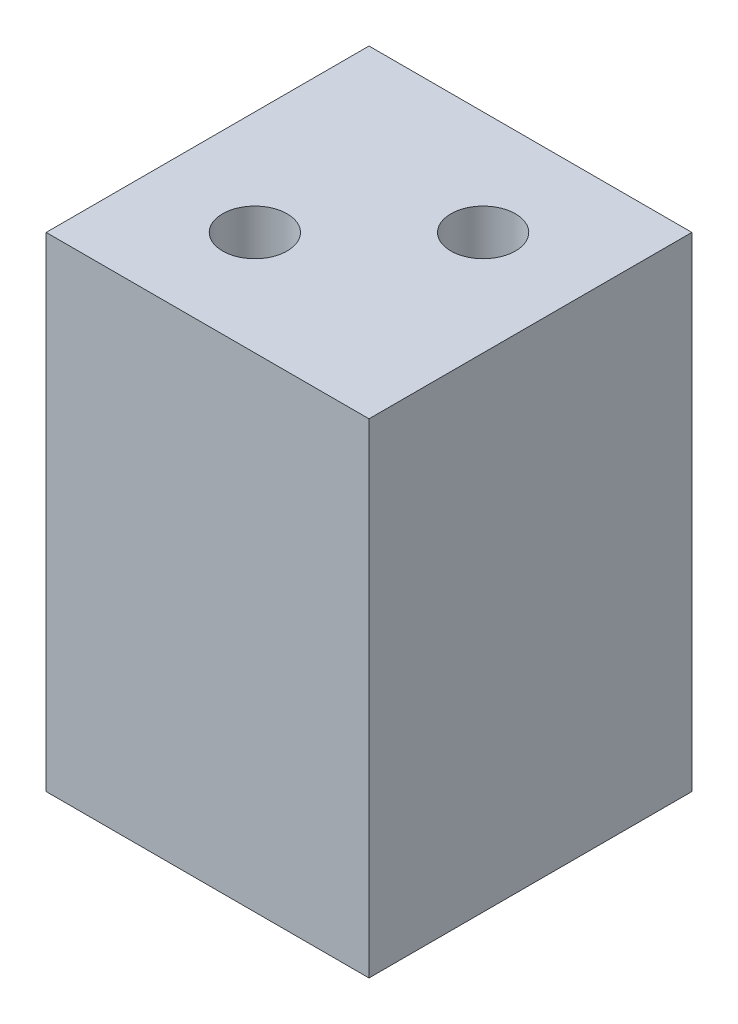
ISO-10303-21;
HEADER;
FILE_DESCRIPTION(('STEP AP214'),'2;1');
FILE_NAME('part.step','',(''),(''),'','','');
FILE_SCHEMA(('AUTOMOTIVE_DESIGN { 1 0 10303 214 1 1 1 1 }'));
ENDSEC;
DATA;
#1=APPLICATION_CONTEXT('core data for automotive mechanical design processes');
#2=APPLICATION_PROTOCOL_DEFINITION('international standard','automotive_design',2000,#1);
#3=PRODUCT_CONTEXT('',#1,'mechanical');
#4=PRODUCT('Part','Part','',(#3));
#5=PRODUCT_RELATED_PRODUCT_CATEGORY('part','',(#4));
#6=PRODUCT_DEFINITION_FORMATION('','',#4);
#7=PRODUCT_DEFINITION_CONTEXT('part definition',#1,'design');
#8=PRODUCT_DEFINITION('design','',#6,#7);
#9=PRODUCT_DEFINITION_SHAPE('','',#8);
#10=(LENGTH_UNIT() NAMED_UNIT(*) SI_UNIT(.MILLI.,.METRE.));
#11=(NAMED_UNIT(*) PLANE_ANGLE_UNIT() SI_UNIT($,.RADIAN.));
#12=(NAMED_UNIT(*) SI_UNIT($,.STERADIAN.) SOLID_ANGLE_UNIT());
#13=UNCERTAINTY_MEASURE_WITH_UNIT(LENGTH_MEASURE(1.E-05),#10,'distance_accuracy_value','');
#14=(GEOMETRIC_REPRESENTATION_CONTEXT(3) GLOBAL_UNCERTAINTY_ASSIGNED_CONTEXT((#13)) GLOBAL_UNIT_ASSIGNED_CONTEXT((#10,
#11,#12)) REPRESENTATION_CONTEXT('',''));
#15=CARTESIAN_POINT('',(0.,0.,0.));
#16=DIRECTION('',(0.,0.,1.));
#17=DIRECTION('',(1.,0.,0.));
#18=AXIS2_PLACEMENT_3D('',#15,#16,#17);
#19=CARTESIAN_POINT('',(0.,45.,0.));
#20=DIRECTION('',(0.,1.,0.));
#21=DIRECTION('',(0.,0.,1.));
#22=AXIS2_PLACEMENT_3D('',#19,#20,#21);
#23=PLANE('',#22);
#24=CARTESIAN_POINT('',(-5.30330085889911,45.,5.3033008588991));
#25=DIRECTION('',(0.,1.,0.));
#26=DIRECTION('',(0.,0.,1.));
#27=AXIS2_PLACEMENT_3D('',#24,#25,#26);
#28=CIRCLE('',#27,3.);
#29=CARTESIAN_POINT('',(-5.30330085889911,45.,2.3033008588991));
#30=VERTEX_POINT('',#29);
#31=EDGE_CURVE('E100',#30,#30,#28,.T.);
#32=ORIENTED_EDGE('',*,*,#31,.F.);
#33=EDGE_LOOP('',(#32));
#34=FACE_BOUND('',#33,.T.);
#35=DIRECTION('',(0.,0.,1.));
#36=VECTOR('',#35,1.);
#37=CARTESIAN_POINT('',(-15.,45.,-15.));
#38=LINE('',#37,#36);
#39=CARTESIAN_POINT('',(-15.,45.,-15.));
#40=VERTEX_POINT('',#39);
#41=CARTESIAN_POINT('',(-15.,45.,15.));
#42=VERTEX_POINT('',#41);
#43=EDGE_CURVE('E85',#40,#42,#38,.T.);
#44=ORIENTED_EDGE('',*,*,#43,.T.);
#45=DIRECTION('',(1.,0.,0.));
#46=VECTOR('',#45,1.);
#47=CARTESIAN_POINT('',(-15.,45.,15.));
#48=LINE('',#47,#46);
#49=CARTESIAN_POINT('',(15.,45.,15.));
#50=VERTEX_POINT('',#49);
#51=EDGE_CURVE('E80',#42,#50,#48,.T.);
#52=ORIENTED_EDGE('',*,*,#51,.T.);
#53=DIRECTION('',(0.,0.,-1.));
#54=VECTOR('',#53,1.);
#55=CARTESIAN_POINT('',(15.,45.,-15.));
#56=LINE('',#55,#54);
#57=CARTESIAN_POINT('',(15.,45.,-15.));
#58=VERTEX_POINT('',#57);
#59=EDGE_CURVE('E83',#50,#58,#56,.T.);
#60=ORIENTED_EDGE('',*,*,#59,.T.);
#61=DIRECTION('',(-1.,0.,0.));
#62=VECTOR('',#61,1.);
#63=CARTESIAN_POINT('',(-15.,45.,-15.));
#64=LINE('',#63,#62);
#65=EDGE_CURVE('E50',#58,#40,#64,.T.);
#66=ORIENTED_EDGE('',*,*,#65,.T.);
#67=EDGE_LOOP('',(#44,#52,#60,#66));
#68=FACE_BOUND('',#67,.T.);
#69=CARTESIAN_POINT('',(5.3033008588991,45.,-5.30330085889911));
#70=DIRECTION('',(0.,1.,0.));
#71=DIRECTION('',(0.,0.,1.));
#72=AXIS2_PLACEMENT_3D('',#69,#70,#71);
#73=CIRCLE('',#72,3.);
#74=CARTESIAN_POINT('',(5.3033008588991,45.,-8.30330085889911));
#75=VERTEX_POINT('',#74);
#76=EDGE_CURVE('E115',#75,#75,#73,.T.);
#77=ORIENTED_EDGE('',*,*,#76,.F.);
#78=EDGE_LOOP('',(#77));
#79=FACE_BOUND('',#78,.T.);
#80=ADVANCED_FACE('F33',(#34,#68,#79),#23,.T.);
#81=CARTESIAN_POINT('',(0.,0.,0.));
#82=DIRECTION('',(0.,1.,0.));
#83=DIRECTION('',(0.,0.,1.));
#84=AXIS2_PLACEMENT_3D('',#81,#82,#83);
#85=PLANE('',#84);
#86=DIRECTION('',(0.,0.,1.));
#87=VECTOR('',#86,1.);
#88=CARTESIAN_POINT('',(-15.,0.,-15.));
#89=LINE('',#88,#87);
#90=CARTESIAN_POINT('',(-15.,0.,-15.));
#91=VERTEX_POINT('',#90);
#92=CARTESIAN_POINT('',(-15.,0.,15.));
#93=VERTEX_POINT('',#92);
#94=EDGE_CURVE('E97',#91,#93,#89,.T.);
#95=ORIENTED_EDGE('',*,*,#94,.F.);
#96=DIRECTION('',(-1.,0.,0.));
#97=VECTOR('',#96,1.);
#98=CARTESIAN_POINT('',(-15.,0.,-15.));
#99=LINE('',#98,#97);
#100=CARTESIAN_POINT('',(15.,0.,-15.));
#101=VERTEX_POINT('',#100);
#102=EDGE_CURVE('E73',#101,#91,#99,.T.);
#103=ORIENTED_EDGE('',*,*,#102,.F.);
#104=DIRECTION('',(0.,0.,-1.));
#105=VECTOR('',#104,1.);
#106=CARTESIAN_POINT('',(15.,0.,-15.));
#107=LINE('',#106,#105);
#108=CARTESIAN_POINT('',(15.,0.,15.));
#109=VERTEX_POINT('',#108);
#110=EDGE_CURVE('E67',#109,#101,#107,.T.);
#111=ORIENTED_EDGE('',*,*,#110,.F.);
#112=DIRECTION('',(1.,0.,0.));
#113=VECTOR('',#112,1.);
#114=CARTESIAN_POINT('',(-15.,0.,15.));
#115=LINE('',#114,#113);
#116=EDGE_CURVE('E89',#93,#109,#115,.T.);
#117=ORIENTED_EDGE('',*,*,#116,.F.);
#118=EDGE_LOOP('',(#95,#103,#111,#117));
#119=FACE_BOUND('',#118,.T.);
#120=CARTESIAN_POINT('',(-5.30330085889911,0.,5.3033008588991));
#121=DIRECTION('',(0.,1.,0.));
#122=DIRECTION('',(0.,0.,1.));
#123=AXIS2_PLACEMENT_3D('',#120,#121,#122);
#124=CIRCLE('',#123,3.);
#125=CARTESIAN_POINT('',(-5.30330085889911,0.,2.3033008588991));
#126=VERTEX_POINT('',#125);
#127=EDGE_CURVE('E112',#126,#126,#124,.T.);
#128=ORIENTED_EDGE('',*,*,#127,.T.);
#129=EDGE_LOOP('',(#128));
#130=FACE_BOUND('',#129,.T.);
#131=CARTESIAN_POINT('',(5.3033008588991,0.,-5.30330085889911));
#132=DIRECTION('',(0.,1.,0.));
#133=DIRECTION('',(0.,0.,1.));
#134=AXIS2_PLACEMENT_3D('',#131,#132,#133);
#135=CIRCLE('',#134,3.);
#136=CARTESIAN_POINT('',(5.3033008588991,0.,-8.30330085889911));
#137=VERTEX_POINT('',#136);
#138=EDGE_CURVE('E118',#137,#137,#135,.T.);
#139=ORIENTED_EDGE('',*,*,#138,.T.);
#140=EDGE_LOOP('',(#139));
#141=FACE_BOUND('',#140,.T.);
#142=ADVANCED_FACE('F108',(#119,#130,#141),#85,.F.);
#143=CARTESIAN_POINT('',(-15.,45.,-15.));
#144=DIRECTION('',(1.,0.,0.));
#145=DIRECTION('',(0.,0.,-1.));
#146=AXIS2_PLACEMENT_3D('',#143,#144,#145);
#147=PLANE('',#146);
#148=ORIENTED_EDGE('',*,*,#94,.T.);
#149=DIRECTION('',(0.,-1.,0.));
#150=VECTOR('',#149,1.);
#151=CARTESIAN_POINT('',(-15.,45.,15.));
#152=LINE('',#151,#150);
#153=EDGE_CURVE('E11',#42,#93,#152,.T.);
#154=ORIENTED_EDGE('',*,*,#153,.F.);
#155=ORIENTED_EDGE('',*,*,#43,.F.);
#156=DIRECTION('',(0.,-1.,0.));
#157=VECTOR('',#156,1.);
#158=CARTESIAN_POINT('',(-15.,45.,-15.));
#159=LINE('',#158,#157);
#160=EDGE_CURVE('E93',#40,#91,#159,.T.);
#161=ORIENTED_EDGE('',*,*,#160,.T.);
#162=EDGE_LOOP('',(#148,#154,#155,#161));
#163=FACE_BOUND('',#162,.T.);
#164=ADVANCED_FACE('F35',(#163),#147,.F.);
#165=CARTESIAN_POINT('',(-15.,45.,15.));
#166=DIRECTION('',(0.,0.,-1.));
#167=DIRECTION('',(-1.,0.,0.));
#168=AXIS2_PLACEMENT_3D('',#165,#166,#167);
#169=PLANE('',#168);
#170=ORIENTED_EDGE('',*,*,#116,.T.);
#171=DIRECTION('',(0.,-1.,0.));
#172=VECTOR('',#171,1.);
#173=CARTESIAN_POINT('',(15.,45.,15.));
#174=LINE('',#173,#172);
#175=EDGE_CURVE('E42',#50,#109,#174,.T.);
#176=ORIENTED_EDGE('',*,*,#175,.F.);
#177=ORIENTED_EDGE('',*,*,#51,.F.);
#178=ORIENTED_EDGE('',*,*,#153,.T.);
#179=EDGE_LOOP('',(#170,#176,#177,#178));
#180=FACE_BOUND('',#179,.T.);
#181=ADVANCED_FACE('F88',(#180),#169,.F.);
#182=CARTESIAN_POINT('',(15.,45.,-15.));
#183=DIRECTION('',(-1.,0.,0.));
#184=DIRECTION('',(0.,0.,1.));
#185=AXIS2_PLACEMENT_3D('',#182,#183,#184);
#186=PLANE('',#185);
#187=ORIENTED_EDGE('',*,*,#110,.T.);
#188=DIRECTION('',(0.,-1.,0.));
#189=VECTOR('',#188,1.);
#190=CARTESIAN_POINT('',(15.,45.,-15.));
#191=LINE('',#190,#189);
#192=EDGE_CURVE('E90',#58,#101,#191,.T.);
#193=ORIENTED_EDGE('',*,*,#192,.F.);
#194=ORIENTED_EDGE('',*,*,#59,.F.);
#195=ORIENTED_EDGE('',*,*,#175,.T.);
#196=EDGE_LOOP('',(#187,#193,#194,#195));
#197=FACE_BOUND('',#196,.T.);
#198=ADVANCED_FACE('F91',(#197),#186,.F.);
#199=CARTESIAN_POINT('',(-15.,45.,-15.));
#200=DIRECTION('',(0.,0.,1.));
#201=DIRECTION('',(1.,0.,0.));
#202=AXIS2_PLACEMENT_3D('',#199,#200,#201);
#203=PLANE('',#202);
#204=ORIENTED_EDGE('',*,*,#102,.T.);
#205=ORIENTED_EDGE('',*,*,#160,.F.);
#206=ORIENTED_EDGE('',*,*,#65,.F.);
#207=ORIENTED_EDGE('',*,*,#192,.T.);
#208=EDGE_LOOP('',(#204,#205,#206,#207));
#209=FACE_BOUND('',#208,.T.);
#210=ADVANCED_FACE('F105',(#209),#203,.F.);
#211=CARTESIAN_POINT('',(-5.30330085889911,45.,5.3033008588991));
#212=DIRECTION('',(0.,-1.,0.));
#213=DIRECTION('',(0.,0.,-1.));
#214=AXIS2_PLACEMENT_3D('',#211,#212,#213);
#215=CYLINDRICAL_SURFACE('',#214,3.);
#216=CARTESIAN_POINT('',(-5.30330085889911,45.,2.3033008588991));
#217=CARTESIAN_POINT('',(-5.30330085889911,44.53125,2.3033008588991));
#218=CARTESIAN_POINT('',(-5.30330085889911,44.0625,2.3033008588991));
#219=CARTESIAN_POINT('',(-5.30330085889911,43.125,2.3033008588991));
#220=CARTESIAN_POINT('',(-5.30330085889911,42.65625,2.3033008588991));
#221=CARTESIAN_POINT('',(-5.30330085889911,41.71875,2.3033008588991));
#222=CARTESIAN_POINT('',(-5.30330085889911,41.25,2.3033008588991));
#223=CARTESIAN_POINT('',(-5.30330085889911,40.3125,2.3033008588991));
#224=CARTESIAN_POINT('',(-5.30330085889911,39.84375,2.3033008588991));
#225=CARTESIAN_POINT('',(-5.30330085889911,38.90625,2.3033008588991));
#226=CARTESIAN_POINT('',(-5.30330085889911,38.4375,2.3033008588991));
#227=CARTESIAN_POINT('',(-5.30330085889911,37.5,2.3033008588991));
#228=CARTESIAN_POINT('',(-5.30330085889911,37.03125,2.3033008588991));
#229=CARTESIAN_POINT('',(-5.30330085889911,36.09375,2.3033008588991));
#230=CARTESIAN_POINT('',(-5.30330085889911,35.625,2.3033008588991));
#231=CARTESIAN_POINT('',(-5.30330085889911,34.6875,2.3033008588991));
#232=CARTESIAN_POINT('',(-5.30330085889911,34.21875,2.3033008588991));
#233=CARTESIAN_POINT('',(-5.30330085889911,33.28125,2.3033008588991));
#234=CARTESIAN_POINT('',(-5.30330085889911,32.8125,2.3033008588991));
#235=CARTESIAN_POINT('',(-5.30330085889911,31.875,2.3033008588991));
#236=CARTESIAN_POINT('',(-5.30330085889911,31.40625,2.3033008588991));
#237=CARTESIAN_POINT('',(-5.30330085889911,30.46875,2.3033008588991));
#238=CARTESIAN_POINT('',(-5.30330085889911,30.,2.3033008588991));
#239=CARTESIAN_POINT('',(-5.30330085889911,29.0625,2.3033008588991));
#240=CARTESIAN_POINT('',(-5.30330085889911,28.59375,2.3033008588991));
#241=CARTESIAN_POINT('',(-5.30330085889911,27.65625,2.3033008588991));
#242=CARTESIAN_POINT('',(-5.30330085889911,27.1875,2.3033008588991));
#243=CARTESIAN_POINT('',(-5.30330085889911,26.25,2.3033008588991));
#244=CARTESIAN_POINT('',(-5.30330085889911,25.78125,2.3033008588991));
#245=CARTESIAN_POINT('',(-5.30330085889911,24.84375,2.3033008588991));
#246=CARTESIAN_POINT('',(-5.30330085889911,24.375,2.3033008588991));
#247=CARTESIAN_POINT('',(-5.30330085889911,23.4375,2.3033008588991));
#248=CARTESIAN_POINT('',(-5.30330085889911,22.96875,2.3033008588991));
#249=CARTESIAN_POINT('',(-5.30330085889911,22.03125,2.3033008588991));
#250=CARTESIAN_POINT('',(-5.30330085889911,21.5625,2.3033008588991));
#251=CARTESIAN_POINT('',(-5.30330085889911,20.625,2.3033008588991));
#252=CARTESIAN_POINT('',(-5.30330085889911,20.15625,2.3033008588991));
#253=CARTESIAN_POINT('',(-5.30330085889911,19.21875,2.3033008588991));
#254=CARTESIAN_POINT('',(-5.30330085889911,18.75,2.3033008588991));
#255=CARTESIAN_POINT('',(-5.30330085889911,17.8125,2.3033008588991));
#256=CARTESIAN_POINT('',(-5.30330085889911,17.34375,2.3033008588991));
#257=CARTESIAN_POINT('',(-5.30330085889911,16.40625,2.3033008588991));
#258=CARTESIAN_POINT('',(-5.30330085889911,15.9375,2.3033008588991));
#259=CARTESIAN_POINT('',(-5.30330085889911,15.,2.3033008588991));
#260=CARTESIAN_POINT('',(-5.30330085889911,14.53125,2.3033008588991));
#261=CARTESIAN_POINT('',(-5.30330085889911,13.59375,2.3033008588991));
#262=CARTESIAN_POINT('',(-5.30330085889911,13.125,2.3033008588991));
#263=CARTESIAN_POINT('',(-5.30330085889911,12.1875,2.3033008588991));
#264=CARTESIAN_POINT('',(-5.30330085889911,11.71875,2.3033008588991));
#265=CARTESIAN_POINT('',(-5.30330085889911,10.78125,2.3033008588991));
#266=CARTESIAN_POINT('',(-5.30330085889911,10.3125,2.3033008588991));
#267=CARTESIAN_POINT('',(-5.30330085889911,9.375,2.3033008588991));
#268=CARTESIAN_POINT('',(-5.30330085889911,8.90625,2.3033008588991));
#269=CARTESIAN_POINT('',(-5.30330085889911,7.96874999999999,2.3033008588991));
#270=CARTESIAN_POINT('',(-5.30330085889911,7.5,2.3033008588991));
#271=CARTESIAN_POINT('',(-5.30330085889911,6.5625,2.3033008588991));
#272=CARTESIAN_POINT('',(-5.30330085889911,6.09375,2.3033008588991));
#273=CARTESIAN_POINT('',(-5.30330085889911,5.15625,2.3033008588991));
#274=CARTESIAN_POINT('',(-5.30330085889911,4.68749999999999,2.3033008588991));
#275=CARTESIAN_POINT('',(-5.30330085889911,3.74999999999999,2.3033008588991));
#276=CARTESIAN_POINT('',(-5.30330085889911,3.28124999999999,2.3033008588991));
#277=CARTESIAN_POINT('',(-5.30330085889911,2.34374999999999,2.3033008588991));
#278=CARTESIAN_POINT('',(-5.30330085889911,1.87499999999999,2.3033008588991));
#279=CARTESIAN_POINT('',(-5.30330085889911,0.937499999999992,2.3033008588991));
#280=CARTESIAN_POINT('',(-5.30330085889911,0.468749999999993,2.3033008588991));
#281=CARTESIAN_POINT('',(-5.30330085889911,0.,2.3033008588991));
#282=B_SPLINE_CURVE_WITH_KNOTS('',3,(#216,#217,#218,#219,#220,#221,#222,#223,#224,#225,#226,
#227,#228,#229,#230,#231,#232,#233,#234,#235,#236,#237,#238,#239,#240,#241,#242,#243,#244,#245,
#246,#247,#248,#249,#250,#251,#252,#253,#254,#255,#256,#257,#258,#259,#260,#261,#262,#263,#264,
#265,#266,#267,#268,#269,#270,#271,#272,#273,#274,#275,#276,#277,#278,#279,#280,#281),
.UNSPECIFIED.,.F.,.F.,(4,2,2,2,2,2,2,2,2,2,2,2,2,2,2,2,2,2,2,2,2,2,2,2,2,2,2,2,2,2,2,2,4),(0.,
1.40625,2.8125,4.21875000000001,5.62500000000001,7.03125,8.4375,9.84375000000001,11.25,12.65625,
14.0625,15.46875,16.875,18.28125,19.6875,21.09375,22.5,23.90625,25.3125,26.71875,28.125,
29.53125,30.9375,32.34375,33.75,35.15625,36.5625,37.96875,39.375,40.78125,42.1875,43.59375,45.),.UNSPECIFIED.);
#283=EDGE_CURVE('BSEAM135',#30,#126,#282,.T.);
#284=ORIENTED_EDGE('',*,*,#31,.T.);
#285=ORIENTED_EDGE('',*,*,#127,.F.);
#286=ORIENTED_EDGE('',*,*,#283,.T.);
#287=ORIENTED_EDGE('',*,*,#283,.F.);
#288=EDGE_LOOP('',(#284,#286,#285,#287));
#289=FACE_BOUND('',#288,.T.);
#290=ADVANCED_FACE('F135',(#289),#215,.F.);
#291=CARTESIAN_POINT('',(5.3033008588991,45.,-5.30330085889911));
#292=DIRECTION('',(0.,-1.,0.));
#293=DIRECTION('',(0.,0.,-1.));
#294=AXIS2_PLACEMENT_3D('',#291,#292,#293);
#295=CYLINDRICAL_SURFACE('',#294,3.);
#296=CARTESIAN_POINT('',(5.3033008588991,45.,-8.30330085889911));
#297=CARTESIAN_POINT('',(5.3033008588991,44.53125,-8.30330085889911));
#298=CARTESIAN_POINT('',(5.3033008588991,44.0625,-8.30330085889911));
#299=CARTESIAN_POINT('',(5.3033008588991,43.125,-8.30330085889911));
#300=CARTESIAN_POINT('',(5.3033008588991,42.65625,-8.30330085889911));
#301=CARTESIAN_POINT('',(5.3033008588991,41.71875,-8.30330085889911));
#302=CARTESIAN_POINT('',(5.3033008588991,41.25,-8.30330085889911));
#303=CARTESIAN_POINT('',(5.3033008588991,40.3125,-8.30330085889911));
#304=CARTESIAN_POINT('',(5.3033008588991,39.84375,-8.30330085889911));
#305=CARTESIAN_POINT('',(5.3033008588991,38.90625,-8.30330085889911));
#306=CARTESIAN_POINT('',(5.3033008588991,38.4375,-8.30330085889911));
#307=CARTESIAN_POINT('',(5.3033008588991,37.5,-8.30330085889911));
#308=CARTESIAN_POINT('',(5.3033008588991,37.03125,-8.30330085889911));
#309=CARTESIAN_POINT('',(5.3033008588991,36.09375,-8.30330085889911));
#310=CARTESIAN_POINT('',(5.3033008588991,35.625,-8.30330085889911));
#311=CARTESIAN_POINT('',(5.3033008588991,34.6875,-8.30330085889911));
#312=CARTESIAN_POINT('',(5.3033008588991,34.21875,-8.30330085889911));
#313=CARTESIAN_POINT('',(5.3033008588991,33.28125,-8.30330085889911));
#314=CARTESIAN_POINT('',(5.3033008588991,32.8125,-8.30330085889911));
#315=CARTESIAN_POINT('',(5.3033008588991,31.875,-8.30330085889911));
#316=CARTESIAN_POINT('',(5.3033008588991,31.40625,-8.30330085889911));
#317=CARTESIAN_POINT('',(5.3033008588991,30.46875,-8.30330085889911));
#318=CARTESIAN_POINT('',(5.3033008588991,30.,-8.30330085889911));
#319=CARTESIAN_POINT('',(5.3033008588991,29.0625,-8.30330085889911));
#320=CARTESIAN_POINT('',(5.3033008588991,28.59375,-8.30330085889911));
#321=CARTESIAN_POINT('',(5.3033008588991,27.65625,-8.30330085889911));
#322=CARTESIAN_POINT('',(5.3033008588991,27.1875,-8.30330085889911));
#323=CARTESIAN_POINT('',(5.3033008588991,26.25,-8.30330085889911));
#324=CARTESIAN_POINT('',(5.3033008588991,25.78125,-8.30330085889911));
#325=CARTESIAN_POINT('',(5.3033008588991,24.84375,-8.30330085889911));
#326=CARTESIAN_POINT('',(5.3033008588991,24.375,-8.30330085889911));
#327=CARTESIAN_POINT('',(5.3033008588991,23.4375,-8.30330085889911));
#328=CARTESIAN_POINT('',(5.3033008588991,22.96875,-8.30330085889911));
#329=CARTESIAN_POINT('',(5.3033008588991,22.03125,-8.30330085889911));
#330=CARTESIAN_POINT('',(5.3033008588991,21.5625,-8.30330085889911));
#331=CARTESIAN_POINT('',(5.3033008588991,20.625,-8.30330085889911));
#332=CARTESIAN_POINT('',(5.3033008588991,20.15625,-8.30330085889911));
#333=CARTESIAN_POINT('',(5.3033008588991,19.21875,-8.30330085889911));
#334=CARTESIAN_POINT('',(5.3033008588991,18.75,-8.30330085889911));
#335=CARTESIAN_POINT('',(5.3033008588991,17.8125,-8.30330085889911));
#336=CARTESIAN_POINT('',(5.3033008588991,17.34375,-8.30330085889911));
#337=CARTESIAN_POINT('',(5.3033008588991,16.40625,-8.30330085889911));
#338=CARTESIAN_POINT('',(5.3033008588991,15.9375,-8.30330085889911));
#339=CARTESIAN_POINT('',(5.3033008588991,15.,-8.30330085889911));
#340=CARTESIAN_POINT('',(5.3033008588991,14.53125,-8.30330085889911));
#341=CARTESIAN_POINT('',(5.3033008588991,13.59375,-8.30330085889911));
#342=CARTESIAN_POINT('',(5.3033008588991,13.125,-8.30330085889911));
#343=CARTESIAN_POINT('',(5.3033008588991,12.1875,-8.30330085889911));
#344=CARTESIAN_POINT('',(5.3033008588991,11.71875,-8.30330085889911));
#345=CARTESIAN_POINT('',(5.3033008588991,10.78125,-8.30330085889911));
#346=CARTESIAN_POINT('',(5.3033008588991,10.3125,-8.30330085889911));
#347=CARTESIAN_POINT('',(5.3033008588991,9.375,-8.30330085889911));
#348=CARTESIAN_POINT('',(5.3033008588991,8.90625,-8.30330085889911));
#349=CARTESIAN_POINT('',(5.3033008588991,7.96874999999999,-8.30330085889911));
#350=CARTESIAN_POINT('',(5.3033008588991,7.5,-8.30330085889911));
#351=CARTESIAN_POINT('',(5.3033008588991,6.5625,-8.30330085889911));
#352=CARTESIAN_POINT('',(5.3033008588991,6.09375,-8.30330085889911));
#353=CARTESIAN_POINT('',(5.3033008588991,5.15625,-8.30330085889911));
#354=CARTESIAN_POINT('',(5.3033008588991,4.68749999999999,-8.30330085889911));
#355=CARTESIAN_POINT('',(5.3033008588991,3.74999999999999,-8.30330085889911));
#356=CARTESIAN_POINT('',(5.3033008588991,3.28124999999999,-8.30330085889911));
#357=CARTESIAN_POINT('',(5.3033008588991,2.34374999999999,-8.30330085889911));
#358=CARTESIAN_POINT('',(5.3033008588991,1.87499999999999,-8.30330085889911));
#359=CARTESIAN_POINT('',(5.3033008588991,0.937499999999992,-8.30330085889911));
#360=CARTESIAN_POINT('',(5.3033008588991,0.468749999999993,-8.30330085889911));
#361=CARTESIAN_POINT('',(5.3033008588991,0.,-8.30330085889911));
#362=B_SPLINE_CURVE_WITH_KNOTS('',3,(#296,#297,#298,#299,#300,#301,#302,#303,#304,#305,#306,
#307,#308,#309,#310,#311,#312,#313,#314,#315,#316,#317,#318,#319,#320,#321,#322,#323,#324,#325,
#326,#327,#328,#329,#330,#331,#332,#333,#334,#335,#336,#337,#338,#339,#340,#341,#342,#343,#344,
#345,#346,#347,#348,#349,#350,#351,#352,#353,#354,#355,#356,#357,#358,#359,#360,#361),
.UNSPECIFIED.,.F.,.F.,(4,2,2,2,2,2,2,2,2,2,2,2,2,2,2,2,2,2,2,2,2,2,2,2,2,2,2,2,2,2,2,2,4),(0.,
1.40625,2.8125,4.21875000000001,5.62500000000001,7.03125,8.4375,9.84375000000001,11.25,12.65625,
14.0625,15.46875,16.875,18.28125,19.6875,21.09375,22.5,23.90625,25.3125,26.71875,28.125,
29.53125,30.9375,32.34375,33.75,35.15625,36.5625,37.96875,39.375,40.78125,42.1875,43.59375,45.),.UNSPECIFIED.);
#363=EDGE_CURVE('BSEAM124',#75,#137,#362,.T.);
#364=ORIENTED_EDGE('',*,*,#76,.T.);
#365=ORIENTED_EDGE('',*,*,#138,.F.);
#366=ORIENTED_EDGE('',*,*,#363,.T.);
#367=ORIENTED_EDGE('',*,*,#363,.F.);
#368=EDGE_LOOP('',(#364,#366,#365,#367));
#369=FACE_BOUND('',#368,.T.);
#370=ADVANCED_FACE('F124',(#369),#295,.F.);
#371=CLOSED_SHELL('',(#80,#142,#164,#181,#198,#210,#290,#370));
#372=MANIFOLD_SOLID_BREP('B2',#371);
#373=ADVANCED_BREP_SHAPE_REPRESENTATION('',(#18,#372),#14);
#374=SHAPE_DEFINITION_REPRESENTATION(#9,#373);
ENDSEC;
END-ISO-10303-21;
